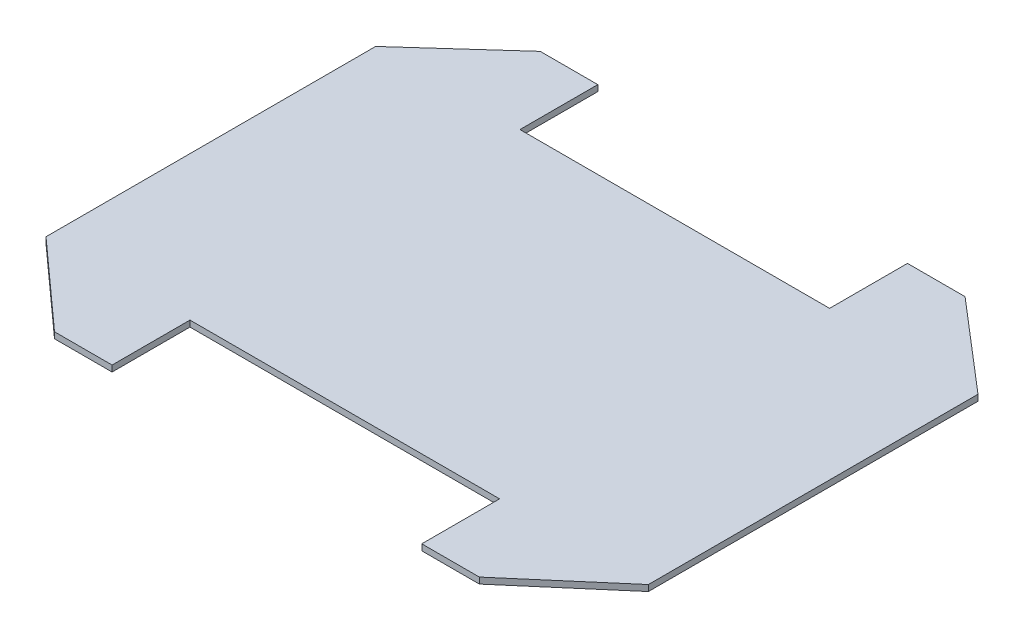
ISO-10303-21;
HEADER;
FILE_DESCRIPTION(('STEP AP214'),'2;1');
FILE_NAME('part.step','',(''),(''),'','','');
FILE_SCHEMA(('AUTOMOTIVE_DESIGN { 1 0 10303 214 1 1 1 1 }'));
ENDSEC;
DATA;
#1=APPLICATION_CONTEXT('core data for automotive mechanical design processes');
#2=APPLICATION_PROTOCOL_DEFINITION('international standard','automotive_design',2000,#1);
#3=PRODUCT_CONTEXT('',#1,'mechanical');
#4=PRODUCT('Part','Part','',(#3));
#5=PRODUCT_RELATED_PRODUCT_CATEGORY('part','',(#4));
#6=PRODUCT_DEFINITION_FORMATION('','',#4);
#7=PRODUCT_DEFINITION_CONTEXT('part definition',#1,'design');
#8=PRODUCT_DEFINITION('design','',#6,#7);
#9=PRODUCT_DEFINITION_SHAPE('','',#8);
#10=(LENGTH_UNIT() NAMED_UNIT(*) SI_UNIT(.MILLI.,.METRE.));
#11=(NAMED_UNIT(*) PLANE_ANGLE_UNIT() SI_UNIT($,.RADIAN.));
#12=(NAMED_UNIT(*) SI_UNIT($,.STERADIAN.) SOLID_ANGLE_UNIT());
#13=UNCERTAINTY_MEASURE_WITH_UNIT(LENGTH_MEASURE(1.E-05),#10,'distance_accuracy_value','');
#14=(GEOMETRIC_REPRESENTATION_CONTEXT(3) GLOBAL_UNCERTAINTY_ASSIGNED_CONTEXT((#13)) GLOBAL_UNIT_ASSIGNED_CONTEXT((#10,
#11,#12)) REPRESENTATION_CONTEXT('',''));
#15=CARTESIAN_POINT('',(0.,0.,0.));
#16=DIRECTION('',(0.,0.,1.));
#17=DIRECTION('',(1.,0.,0.));
#18=AXIS2_PLACEMENT_3D('',#15,#16,#17);
#19=CARTESIAN_POINT('',(-140.586469874335,5.5,-74.8243344297625));
#20=DIRECTION('',(-1.,0.,0.));
#21=DIRECTION('',(0.,0.,1.));
#22=AXIS2_PLACEMENT_3D('',#19,#20,#21);
#23=PLANE('',#22);
#24=DIRECTION('',(0.,0.,-1.));
#25=VECTOR('',#24,1.);
#26=CARTESIAN_POINT('',(-140.586469874335,0.,-74.8243344297625));
#27=LINE('',#26,#25);
#28=CARTESIAN_POINT('',(-140.586469874335,0.,-74.8243344297625));
#29=VERTEX_POINT('',#28);
#30=CARTESIAN_POINT('',(-140.586469874335,0.,-145.141499307877));
#31=VERTEX_POINT('',#30);
#32=EDGE_CURVE('E177',#29,#31,#27,.T.);
#33=ORIENTED_EDGE('',*,*,#32,.T.);
#34=DIRECTION('',(0.,-1.,0.));
#35=VECTOR('',#34,1.);
#36=CARTESIAN_POINT('',(-140.586469874335,5.5,-145.141499307877));
#37=LINE('',#36,#35);
#38=CARTESIAN_POINT('',(-140.586469874335,5.5,-145.141499307877));
#39=VERTEX_POINT('',#38);
#40=EDGE_CURVE('E11',#39,#31,#37,.T.);
#41=ORIENTED_EDGE('',*,*,#40,.F.);
#42=DIRECTION('',(0.,0.,-1.));
#43=VECTOR('',#42,1.);
#44=CARTESIAN_POINT('',(-140.586469874335,5.5,-74.8243344297625));
#45=LINE('',#44,#43);
#46=CARTESIAN_POINT('',(-140.586469874335,5.5,-74.8243344297625));
#47=VERTEX_POINT('',#46);
#48=EDGE_CURVE('E207',#47,#39,#45,.T.);
#49=ORIENTED_EDGE('',*,*,#48,.F.);
#50=DIRECTION('',(0.,-1.,0.));
#51=VECTOR('',#50,1.);
#52=CARTESIAN_POINT('',(-140.586469874335,5.5,-74.8243344297625));
#53=LINE('',#52,#51);
#54=EDGE_CURVE('E173',#47,#29,#53,.T.);
#55=ORIENTED_EDGE('',*,*,#54,.T.);
#56=EDGE_LOOP('',(#33,#41,#49,#55));
#57=FACE_BOUND('',#56,.T.);
#58=ADVANCED_FACE('F33',(#57),#23,.F.);
#59=CARTESIAN_POINT('',(-140.586469874335,5.5,-145.141499307877));
#60=DIRECTION('',(0.,0.,1.));
#61=DIRECTION('',(1.,0.,0.));
#62=AXIS2_PLACEMENT_3D('',#59,#60,#61);
#63=PLANE('',#62);
#64=DIRECTION('',(-1.,0.,0.));
#65=VECTOR('',#64,1.);
#66=CARTESIAN_POINT('',(-140.586469874335,0.,-145.141499307877));
#67=LINE('',#66,#65);
#68=CARTESIAN_POINT('',(-192.586469874335,0.,-145.141499307877));
#69=VERTEX_POINT('',#68);
#70=EDGE_CURVE('E180',#31,#69,#67,.T.);
#71=ORIENTED_EDGE('',*,*,#70,.T.);
#72=DIRECTION('',(0.,-1.,0.));
#73=VECTOR('',#72,1.);
#74=CARTESIAN_POINT('',(-192.586469874335,5.5,-145.141499307877));
#75=LINE('',#74,#73);
#76=CARTESIAN_POINT('',(-192.586469874335,5.5,-145.141499307877));
#77=VERTEX_POINT('',#76);
#78=EDGE_CURVE('E41',#77,#69,#75,.T.);
#79=ORIENTED_EDGE('',*,*,#78,.F.);
#80=DIRECTION('',(-1.,0.,0.));
#81=VECTOR('',#80,1.);
#82=CARTESIAN_POINT('',(-140.586469874335,5.5,-145.141499307877));
#83=LINE('',#82,#81);
#84=EDGE_CURVE('E116',#39,#77,#83,.T.);
#85=ORIENTED_EDGE('',*,*,#84,.F.);
#86=ORIENTED_EDGE('',*,*,#40,.T.);
#87=EDGE_LOOP('',(#71,#79,#85,#86));
#88=FACE_BOUND('',#87,.T.);
#89=ADVANCED_FACE('F305',(#88),#63,.F.);
#90=CARTESIAN_POINT('',(-270.75908450294,5.5,-74.6606808376328));
#91=DIRECTION('',(0.669623042952427,0.,0.7427011379735));
#92=DIRECTION('',(0.7427011379735,0.,-0.669623042952427));
#93=AXIS2_PLACEMENT_3D('',#90,#91,#92);
#94=PLANE('',#93);
#95=DIRECTION('',(-0.7427011379735,0.,0.669623042952427));
#96=VECTOR('',#95,1.);
#97=CARTESIAN_POINT('',(-270.75908450294,0.,-74.6606808376328));
#98=LINE('',#97,#96);
#99=CARTESIAN_POINT('',(-270.75908450294,0.,-74.6606808376328));
#100=VERTEX_POINT('',#99);
#101=EDGE_CURVE('E182',#69,#100,#98,.T.);
#102=ORIENTED_EDGE('',*,*,#101,.T.);
#103=DIRECTION('',(0.,-1.,0.));
#104=VECTOR('',#103,1.);
#105=CARTESIAN_POINT('',(-270.75908450294,5.5,-74.6606808376328));
#106=LINE('',#105,#104);
#107=CARTESIAN_POINT('',(-270.75908450294,5.5,-74.6606808376328));
#108=VERTEX_POINT('',#107);
#109=EDGE_CURVE('E238',#108,#100,#106,.T.);
#110=ORIENTED_EDGE('',*,*,#109,.F.);
#111=DIRECTION('',(-0.7427011379735,0.,0.669623042952427));
#112=VECTOR('',#111,1.);
#113=CARTESIAN_POINT('',(-270.75908450294,5.5,-74.6606808376328));
#114=LINE('',#113,#112);
#115=EDGE_CURVE('E246',#77,#108,#114,.T.);
#116=ORIENTED_EDGE('',*,*,#115,.F.);
#117=ORIENTED_EDGE('',*,*,#78,.T.);
#118=EDGE_LOOP('',(#102,#110,#116,#117));
#119=FACE_BOUND('',#118,.T.);
#120=ADVANCED_FACE('F244',(#119),#94,.F.);
#121=CARTESIAN_POINT('',(-270.75908450294,5.5,-74.6606808376328));
#122=DIRECTION('',(1.,0.,0.));
#123=DIRECTION('',(0.,0.,-1.));
#124=AXIS2_PLACEMENT_3D('',#121,#122,#123);
#125=PLANE('',#124);
#126=DIRECTION('',(0.,0.,1.));
#127=VECTOR('',#126,1.);
#128=CARTESIAN_POINT('',(-270.75908450294,0.,-74.6606808376328));
#129=LINE('',#128,#127);
#130=CARTESIAN_POINT('',(-270.75908450294,0.,223.012011978108));
#131=VERTEX_POINT('',#130);
#132=EDGE_CURVE('E184',#100,#131,#129,.T.);
#133=ORIENTED_EDGE('',*,*,#132,.T.);
#134=DIRECTION('',(0.,-1.,0.));
#135=VECTOR('',#134,1.);
#136=CARTESIAN_POINT('',(-270.75908450294,5.5,223.012011978108));
#137=LINE('',#136,#135);
#138=CARTESIAN_POINT('',(-270.75908450294,5.5,223.012011978108));
#139=VERTEX_POINT('',#138);
#140=EDGE_CURVE('E235',#139,#131,#137,.T.);
#141=ORIENTED_EDGE('',*,*,#140,.F.);
#142=DIRECTION('',(0.,0.,1.));
#143=VECTOR('',#142,1.);
#144=CARTESIAN_POINT('',(-270.75908450294,5.5,-74.6606808376328));
#145=LINE('',#144,#143);
#146=EDGE_CURVE('E264',#108,#139,#145,.T.);
#147=ORIENTED_EDGE('',*,*,#146,.F.);
#148=ORIENTED_EDGE('',*,*,#109,.T.);
#149=EDGE_LOOP('',(#133,#141,#147,#148));
#150=FACE_BOUND('',#149,.T.);
#151=ADVANCED_FACE('F255',(#150),#125,.F.);
#152=CARTESIAN_POINT('',(-270.75908450294,5.5,223.012011978108));
#153=DIRECTION('',(0.669623042952427,0.,-0.7427011379735));
#154=DIRECTION('',(-0.7427011379735,0.,-0.669623042952427));
#155=AXIS2_PLACEMENT_3D('',#152,#153,#154);
#156=PLANE('',#155);
#157=DIRECTION('',(0.7427011379735,0.,0.669623042952427));
#158=VECTOR('',#157,1.);
#159=CARTESIAN_POINT('',(-270.75908450294,0.,223.012011978108));
#160=LINE('',#159,#158);
#161=CARTESIAN_POINT('',(-192.586469874335,0.,293.492830448352));
#162=VERTEX_POINT('',#161);
#163=EDGE_CURVE('E186',#131,#162,#160,.T.);
#164=ORIENTED_EDGE('',*,*,#163,.T.);
#165=DIRECTION('',(0.,-1.,0.));
#166=VECTOR('',#165,1.);
#167=CARTESIAN_POINT('',(-192.586469874335,5.5,293.492830448352));
#168=LINE('',#167,#166);
#169=CARTESIAN_POINT('',(-192.586469874335,5.5,293.492830448352));
#170=VERTEX_POINT('',#169);
#171=EDGE_CURVE('E232',#170,#162,#168,.T.);
#172=ORIENTED_EDGE('',*,*,#171,.F.);
#173=DIRECTION('',(0.7427011379735,0.,0.669623042952427));
#174=VECTOR('',#173,1.);
#175=CARTESIAN_POINT('',(-270.75908450294,5.5,223.012011978108));
#176=LINE('',#175,#174);
#177=EDGE_CURVE('E261',#139,#170,#176,.T.);
#178=ORIENTED_EDGE('',*,*,#177,.F.);
#179=ORIENTED_EDGE('',*,*,#140,.T.);
#180=EDGE_LOOP('',(#164,#172,#178,#179));
#181=FACE_BOUND('',#180,.T.);
#182=ADVANCED_FACE('F259',(#181),#156,.F.);
#183=CARTESIAN_POINT('',(-140.586469874335,5.5,293.492830448352));
#184=DIRECTION('',(0.,0.,-1.));
#185=DIRECTION('',(-1.,0.,0.));
#186=AXIS2_PLACEMENT_3D('',#183,#184,#185);
#187=PLANE('',#186);
#188=DIRECTION('',(1.,0.,0.));
#189=VECTOR('',#188,1.);
#190=CARTESIAN_POINT('',(-140.586469874335,0.,293.492830448352));
#191=LINE('',#190,#189);
#192=CARTESIAN_POINT('',(-140.586469874335,0.,293.492830448352));
#193=VERTEX_POINT('',#192);
#194=EDGE_CURVE('E188',#162,#193,#191,.T.);
#195=ORIENTED_EDGE('',*,*,#194,.T.);
#196=DIRECTION('',(0.,-1.,0.));
#197=VECTOR('',#196,1.);
#198=CARTESIAN_POINT('',(-140.586469874335,5.5,293.492830448352));
#199=LINE('',#198,#197);
#200=CARTESIAN_POINT('',(-140.586469874335,5.5,293.492830448352));
#201=VERTEX_POINT('',#200);
#202=EDGE_CURVE('E229',#201,#193,#199,.T.);
#203=ORIENTED_EDGE('',*,*,#202,.F.);
#204=DIRECTION('',(1.,0.,0.));
#205=VECTOR('',#204,1.);
#206=CARTESIAN_POINT('',(-140.586469874335,5.5,293.492830448352));
#207=LINE('',#206,#205);
#208=EDGE_CURVE('E263',#170,#201,#207,.T.);
#209=ORIENTED_EDGE('',*,*,#208,.F.);
#210=ORIENTED_EDGE('',*,*,#171,.T.);
#211=EDGE_LOOP('',(#195,#203,#209,#210));
#212=FACE_BOUND('',#211,.T.);
#213=ADVANCED_FACE('F318',(#212),#187,.F.);
#214=CARTESIAN_POINT('',(-140.586469874335,5.5,223.175665570237));
#215=DIRECTION('',(-1.,0.,0.));
#216=DIRECTION('',(0.,0.,1.));
#217=AXIS2_PLACEMENT_3D('',#214,#215,#216);
#218=PLANE('',#217);
#219=DIRECTION('',(0.,0.,-1.));
#220=VECTOR('',#219,1.);
#221=CARTESIAN_POINT('',(-140.586469874335,0.,223.175665570237));
#222=LINE('',#221,#220);
#223=CARTESIAN_POINT('',(-140.586469874335,0.,223.175665570237));
#224=VERTEX_POINT('',#223);
#225=EDGE_CURVE('E190',#193,#224,#222,.T.);
#226=ORIENTED_EDGE('',*,*,#225,.T.);
#227=DIRECTION('',(0.,-1.,0.));
#228=VECTOR('',#227,1.);
#229=CARTESIAN_POINT('',(-140.586469874335,5.5,223.175665570237));
#230=LINE('',#229,#228);
#231=CARTESIAN_POINT('',(-140.586469874335,5.5,223.175665570237));
#232=VERTEX_POINT('',#231);
#233=EDGE_CURVE('E226',#232,#224,#230,.T.);
#234=ORIENTED_EDGE('',*,*,#233,.F.);
#235=DIRECTION('',(0.,0.,-1.));
#236=VECTOR('',#235,1.);
#237=CARTESIAN_POINT('',(-140.586469874335,5.5,223.175665570237));
#238=LINE('',#237,#236);
#239=EDGE_CURVE('E266',#201,#232,#238,.T.);
#240=ORIENTED_EDGE('',*,*,#239,.F.);
#241=ORIENTED_EDGE('',*,*,#202,.T.);
#242=EDGE_LOOP('',(#226,#234,#240,#241));
#243=FACE_BOUND('',#242,.T.);
#244=ADVANCED_FACE('F321',(#243),#218,.F.);
#245=CARTESIAN_POINT('',(-140.586469874335,5.5,223.175665570237));
#246=DIRECTION('',(0.,0.,-1.));
#247=DIRECTION('',(-1.,0.,0.));
#248=AXIS2_PLACEMENT_3D('',#245,#246,#247);
#249=PLANE('',#248);
#250=DIRECTION('',(1.,0.,0.));
#251=VECTOR('',#250,1.);
#252=CARTESIAN_POINT('',(-140.586469874335,0.,223.175665570237));
#253=LINE('',#252,#251);
#254=CARTESIAN_POINT('',(139.068300868454,0.,223.175665570237));
#255=VERTEX_POINT('',#254);
#256=EDGE_CURVE('E192',#224,#255,#253,.T.);
#257=ORIENTED_EDGE('',*,*,#256,.T.);
#258=DIRECTION('',(0.,-1.,0.));
#259=VECTOR('',#258,1.);
#260=CARTESIAN_POINT('',(139.068300868454,5.5,223.175665570237));
#261=LINE('',#260,#259);
#262=CARTESIAN_POINT('',(139.068300868454,5.5,223.175665570237));
#263=VERTEX_POINT('',#262);
#264=EDGE_CURVE('E223',#263,#255,#261,.T.);
#265=ORIENTED_EDGE('',*,*,#264,.F.);
#266=DIRECTION('',(1.,0.,0.));
#267=VECTOR('',#266,1.);
#268=CARTESIAN_POINT('',(-140.586469874335,5.5,223.175665570237));
#269=LINE('',#268,#267);
#270=EDGE_CURVE('E272',#232,#263,#269,.T.);
#271=ORIENTED_EDGE('',*,*,#270,.F.);
#272=ORIENTED_EDGE('',*,*,#233,.T.);
#273=EDGE_LOOP('',(#257,#265,#271,#272));
#274=FACE_BOUND('',#273,.T.);
#275=ADVANCED_FACE('F325',(#274),#249,.F.);
#276=CARTESIAN_POINT('',(139.068300868454,5.5,223.175665570237));
#277=DIRECTION('',(1.,0.,0.));
#278=DIRECTION('',(0.,0.,-1.));
#279=AXIS2_PLACEMENT_3D('',#276,#277,#278);
#280=PLANE('',#279);
#281=DIRECTION('',(0.,0.,1.));
#282=VECTOR('',#281,1.);
#283=CARTESIAN_POINT('',(139.068300868454,0.,223.175665570237));
#284=LINE('',#283,#282);
#285=CARTESIAN_POINT('',(139.068300868454,0.,293.492830448352));
#286=VERTEX_POINT('',#285);
#287=EDGE_CURVE('E194',#255,#286,#284,.T.);
#288=ORIENTED_EDGE('',*,*,#287,.T.);
#289=DIRECTION('',(0.,-1.,0.));
#290=VECTOR('',#289,1.);
#291=CARTESIAN_POINT('',(139.068300868454,5.5,293.492830448352));
#292=LINE('',#291,#290);
#293=CARTESIAN_POINT('',(139.068300868454,5.5,293.492830448352));
#294=VERTEX_POINT('',#293);
#295=EDGE_CURVE('E220',#294,#286,#292,.T.);
#296=ORIENTED_EDGE('',*,*,#295,.F.);
#297=DIRECTION('',(0.,0.,1.));
#298=VECTOR('',#297,1.);
#299=CARTESIAN_POINT('',(139.068300868454,5.5,223.175665570237));
#300=LINE('',#299,#298);
#301=EDGE_CURVE('E274',#263,#294,#300,.T.);
#302=ORIENTED_EDGE('',*,*,#301,.F.);
#303=ORIENTED_EDGE('',*,*,#264,.T.);
#304=EDGE_LOOP('',(#288,#296,#302,#303));
#305=FACE_BOUND('',#304,.T.);
#306=ADVANCED_FACE('F329',(#305),#280,.F.);
#307=CARTESIAN_POINT('',(139.068300868454,5.5,293.492830448352));
#308=DIRECTION('',(0.,0.,-1.));
#309=DIRECTION('',(-1.,0.,0.));
#310=AXIS2_PLACEMENT_3D('',#307,#308,#309);
#311=PLANE('',#310);
#312=DIRECTION('',(1.,0.,0.));
#313=VECTOR('',#312,1.);
#314=CARTESIAN_POINT('',(139.068300868454,0.,293.492830448352));
#315=LINE('',#314,#313);
#316=CARTESIAN_POINT('',(191.068300868454,0.,293.492830448352));
#317=VERTEX_POINT('',#316);
#318=EDGE_CURVE('E196',#286,#317,#315,.T.);
#319=ORIENTED_EDGE('',*,*,#318,.T.);
#320=DIRECTION('',(0.,-1.,0.));
#321=VECTOR('',#320,1.);
#322=CARTESIAN_POINT('',(191.068300868454,5.5,293.492830448352));
#323=LINE('',#322,#321);
#324=CARTESIAN_POINT('',(191.068300868454,5.5,293.492830448352));
#325=VERTEX_POINT('',#324);
#326=EDGE_CURVE('E217',#325,#317,#323,.T.);
#327=ORIENTED_EDGE('',*,*,#326,.F.);
#328=DIRECTION('',(1.,0.,0.));
#329=VECTOR('',#328,1.);
#330=CARTESIAN_POINT('',(139.068300868454,5.5,293.492830448352));
#331=LINE('',#330,#329);
#332=EDGE_CURVE('E276',#294,#325,#331,.T.);
#333=ORIENTED_EDGE('',*,*,#332,.F.);
#334=ORIENTED_EDGE('',*,*,#295,.T.);
#335=EDGE_LOOP('',(#319,#327,#333,#334));
#336=FACE_BOUND('',#335,.T.);
#337=ADVANCED_FACE('F333',(#336),#311,.F.);
#338=CARTESIAN_POINT('',(273.24091549706,5.5,223.012011978108));
#339=DIRECTION('',(-0.651042402792643,0.,-0.759041362355163));
#340=DIRECTION('',(-0.759041362355163,0.,0.651042402792643));
#341=AXIS2_PLACEMENT_3D('',#338,#339,#340);
#342=PLANE('',#341);
#343=DIRECTION('',(0.759041362355163,0.,-0.651042402792643));
#344=VECTOR('',#343,1.);
#345=CARTESIAN_POINT('',(273.24091549706,0.,223.012011978108));
#346=LINE('',#345,#344);
#347=CARTESIAN_POINT('',(273.24091549706,0.,223.012011978108));
#348=VERTEX_POINT('',#347);
#349=EDGE_CURVE('E198',#317,#348,#346,.T.);
#350=ORIENTED_EDGE('',*,*,#349,.T.);
#351=DIRECTION('',(0.,-1.,0.));
#352=VECTOR('',#351,1.);
#353=CARTESIAN_POINT('',(273.24091549706,5.5,223.012011978108));
#354=LINE('',#353,#352);
#355=CARTESIAN_POINT('',(273.24091549706,5.5,223.012011978108));
#356=VERTEX_POINT('',#355);
#357=EDGE_CURVE('E214',#356,#348,#354,.T.);
#358=ORIENTED_EDGE('',*,*,#357,.F.);
#359=DIRECTION('',(0.759041362355163,0.,-0.651042402792643));
#360=VECTOR('',#359,1.);
#361=CARTESIAN_POINT('',(273.24091549706,5.5,223.012011978108));
#362=LINE('',#361,#360);
#363=EDGE_CURVE('E278',#325,#356,#362,.T.);
#364=ORIENTED_EDGE('',*,*,#363,.F.);
#365=ORIENTED_EDGE('',*,*,#326,.T.);
#366=EDGE_LOOP('',(#350,#358,#364,#365));
#367=FACE_BOUND('',#366,.T.);
#368=ADVANCED_FACE('F337',(#367),#342,.F.);
#369=CARTESIAN_POINT('',(273.24091549706,5.5,-74.6606808376328));
#370=DIRECTION('',(-1.,0.,0.));
#371=DIRECTION('',(0.,0.,1.));
#372=AXIS2_PLACEMENT_3D('',#369,#370,#371);
#373=PLANE('',#372);
#374=DIRECTION('',(0.,0.,-1.));
#375=VECTOR('',#374,1.);
#376=CARTESIAN_POINT('',(273.24091549706,0.,-74.6606808376328));
#377=LINE('',#376,#375);
#378=CARTESIAN_POINT('',(273.24091549706,0.,-74.6606808376328));
#379=VERTEX_POINT('',#378);
#380=EDGE_CURVE('E200',#348,#379,#377,.T.);
#381=ORIENTED_EDGE('',*,*,#380,.T.);
#382=DIRECTION('',(0.,-1.,0.));
#383=VECTOR('',#382,1.);
#384=CARTESIAN_POINT('',(273.24091549706,5.5,-74.6606808376328));
#385=LINE('',#384,#383);
#386=CARTESIAN_POINT('',(273.24091549706,5.5,-74.6606808376328));
#387=VERTEX_POINT('',#386);
#388=EDGE_CURVE('E211',#387,#379,#385,.T.);
#389=ORIENTED_EDGE('',*,*,#388,.F.);
#390=DIRECTION('',(0.,0.,-1.));
#391=VECTOR('',#390,1.);
#392=CARTESIAN_POINT('',(273.24091549706,5.5,-74.6606808376328));
#393=LINE('',#392,#391);
#394=EDGE_CURVE('E280',#356,#387,#393,.T.);
#395=ORIENTED_EDGE('',*,*,#394,.F.);
#396=ORIENTED_EDGE('',*,*,#357,.T.);
#397=EDGE_LOOP('',(#381,#389,#395,#396));
#398=FACE_BOUND('',#397,.T.);
#399=ADVANCED_FACE('F286',(#398),#373,.F.);
#400=CARTESIAN_POINT('',(273.24091549706,5.5,-74.6606808376328));
#401=DIRECTION('',(-0.651042402792644,0.,0.759041362355163));
#402=DIRECTION('',(0.759041362355163,0.,0.651042402792644));
#403=AXIS2_PLACEMENT_3D('',#400,#401,#402);
#404=PLANE('',#403);
#405=DIRECTION('',(-0.759041362355163,0.,-0.651042402792643));
#406=VECTOR('',#405,1.);
#407=CARTESIAN_POINT('',(273.24091549706,0.,-74.6606808376328));
#408=LINE('',#407,#406);
#409=CARTESIAN_POINT('',(191.068300868454,0.,-145.141499307877));
#410=VERTEX_POINT('',#409);
#411=EDGE_CURVE('E202',#379,#410,#408,.T.);
#412=ORIENTED_EDGE('',*,*,#411,.T.);
#413=DIRECTION('',(0.,-1.,0.));
#414=VECTOR('',#413,1.);
#415=CARTESIAN_POINT('',(191.068300868454,5.5,-145.141499307877));
#416=LINE('',#415,#414);
#417=CARTESIAN_POINT('',(191.068300868454,5.5,-145.141499307877));
#418=VERTEX_POINT('',#417);
#419=EDGE_CURVE('E168',#418,#410,#416,.T.);
#420=ORIENTED_EDGE('',*,*,#419,.F.);
#421=DIRECTION('',(-0.759041362355163,0.,-0.651042402792643));
#422=VECTOR('',#421,1.);
#423=CARTESIAN_POINT('',(273.24091549706,5.5,-74.6606808376328));
#424=LINE('',#423,#422);
#425=EDGE_CURVE('E159',#387,#418,#424,.T.);
#426=ORIENTED_EDGE('',*,*,#425,.F.);
#427=ORIENTED_EDGE('',*,*,#388,.T.);
#428=EDGE_LOOP('',(#412,#420,#426,#427));
#429=FACE_BOUND('',#428,.T.);
#430=ADVANCED_FACE('F290',(#429),#404,.F.);
#431=CARTESIAN_POINT('',(139.068300868454,5.5,-145.141499307877));
#432=DIRECTION('',(0.,0.,1.));
#433=DIRECTION('',(1.,0.,0.));
#434=AXIS2_PLACEMENT_3D('',#431,#432,#433);
#435=PLANE('',#434);
#436=DIRECTION('',(-1.,0.,0.));
#437=VECTOR('',#436,1.);
#438=CARTESIAN_POINT('',(139.068300868454,0.,-145.141499307877));
#439=LINE('',#438,#437);
#440=CARTESIAN_POINT('',(139.068300868454,0.,-145.141499307877));
#441=VERTEX_POINT('',#440);
#442=EDGE_CURVE('E167',#410,#441,#439,.T.);
#443=ORIENTED_EDGE('',*,*,#442,.T.);
#444=DIRECTION('',(0.,-1.,0.));
#445=VECTOR('',#444,1.);
#446=CARTESIAN_POINT('',(139.068300868454,5.5,-145.141499307877));
#447=LINE('',#446,#445);
#448=CARTESIAN_POINT('',(139.068300868454,5.5,-145.141499307877));
#449=VERTEX_POINT('',#448);
#450=EDGE_CURVE('E164',#449,#441,#447,.T.);
#451=ORIENTED_EDGE('',*,*,#450,.F.);
#452=DIRECTION('',(-1.,0.,0.));
#453=VECTOR('',#452,1.);
#454=CARTESIAN_POINT('',(139.068300868454,5.5,-145.141499307877));
#455=LINE('',#454,#453);
#456=EDGE_CURVE('E153',#418,#449,#455,.T.);
#457=ORIENTED_EDGE('',*,*,#456,.F.);
#458=ORIENTED_EDGE('',*,*,#419,.T.);
#459=EDGE_LOOP('',(#443,#451,#457,#458));
#460=FACE_BOUND('',#459,.T.);
#461=ADVANCED_FACE('F165',(#460),#435,.F.);
#462=CARTESIAN_POINT('',(139.068300868454,5.5,-74.8243344297626));
#463=DIRECTION('',(1.,0.,0.));
#464=DIRECTION('',(0.,0.,-1.));
#465=AXIS2_PLACEMENT_3D('',#462,#463,#464);
#466=PLANE('',#465);
#467=DIRECTION('',(0.,0.,1.));
#468=VECTOR('',#467,1.);
#469=CARTESIAN_POINT('',(139.068300868454,0.,-74.8243344297626));
#470=LINE('',#469,#468);
#471=CARTESIAN_POINT('',(139.068300868454,0.,-74.8243344297626));
#472=VERTEX_POINT('',#471);
#473=EDGE_CURVE('E102',#441,#472,#470,.T.);
#474=ORIENTED_EDGE('',*,*,#473,.T.);
#475=DIRECTION('',(0.,-1.,0.));
#476=VECTOR('',#475,1.);
#477=CARTESIAN_POINT('',(139.068300868454,5.5,-74.8243344297626));
#478=LINE('',#477,#476);
#479=CARTESIAN_POINT('',(139.068300868454,5.5,-74.8243344297626));
#480=VERTEX_POINT('',#479);
#481=EDGE_CURVE('E169',#480,#472,#478,.T.);
#482=ORIENTED_EDGE('',*,*,#481,.F.);
#483=DIRECTION('',(0.,0.,1.));
#484=VECTOR('',#483,1.);
#485=CARTESIAN_POINT('',(139.068300868454,5.5,-74.8243344297626));
#486=LINE('',#485,#484);
#487=EDGE_CURVE('E157',#449,#480,#486,.T.);
#488=ORIENTED_EDGE('',*,*,#487,.F.);
#489=ORIENTED_EDGE('',*,*,#450,.T.);
#490=EDGE_LOOP('',(#474,#482,#488,#489));
#491=FACE_BOUND('',#490,.T.);
#492=ADVANCED_FACE('F171',(#491),#466,.F.);
#493=CARTESIAN_POINT('',(-140.586469874335,5.5,-74.8243344297625));
#494=DIRECTION('',(0.,0.,1.));
#495=DIRECTION('',(1.,0.,0.));
#496=AXIS2_PLACEMENT_3D('',#493,#494,#495);
#497=PLANE('',#496);
#498=DIRECTION('',(-1.,0.,0.));
#499=VECTOR('',#498,1.);
#500=CARTESIAN_POINT('',(-140.586469874335,0.,-74.8243344297625));
#501=LINE('',#500,#499);
#502=EDGE_CURVE('E108',#472,#29,#501,.T.);
#503=ORIENTED_EDGE('',*,*,#502,.T.);
#504=ORIENTED_EDGE('',*,*,#54,.F.);
#505=DIRECTION('',(-1.,0.,0.));
#506=VECTOR('',#505,1.);
#507=CARTESIAN_POINT('',(-140.586469874335,5.5,-74.8243344297625));
#508=LINE('',#507,#506);
#509=EDGE_CURVE('E49',#480,#47,#508,.T.);
#510=ORIENTED_EDGE('',*,*,#509,.F.);
#511=ORIENTED_EDGE('',*,*,#481,.T.);
#512=EDGE_LOOP('',(#503,#504,#510,#511));
#513=FACE_BOUND('',#512,.T.);
#514=ADVANCED_FACE('F294',(#513),#497,.F.);
#515=CARTESIAN_POINT('',(-140.586469874335,5.5,-145.141499307877));
#516=DIRECTION('',(0.,1.,0.));
#517=DIRECTION('',(0.,0.,1.));
#518=AXIS2_PLACEMENT_3D('',#515,#516,#517);
#519=PLANE('',#518);
#520=ORIENTED_EDGE('',*,*,#48,.T.);
#521=ORIENTED_EDGE('',*,*,#84,.T.);
#522=ORIENTED_EDGE('',*,*,#115,.T.);
#523=ORIENTED_EDGE('',*,*,#146,.T.);
#524=ORIENTED_EDGE('',*,*,#177,.T.);
#525=ORIENTED_EDGE('',*,*,#208,.T.);
#526=ORIENTED_EDGE('',*,*,#239,.T.);
#527=ORIENTED_EDGE('',*,*,#270,.T.);
#528=ORIENTED_EDGE('',*,*,#301,.T.);
#529=ORIENTED_EDGE('',*,*,#332,.T.);
#530=ORIENTED_EDGE('',*,*,#363,.T.);
#531=ORIENTED_EDGE('',*,*,#394,.T.);
#532=ORIENTED_EDGE('',*,*,#425,.T.);
#533=ORIENTED_EDGE('',*,*,#456,.T.);
#534=ORIENTED_EDGE('',*,*,#487,.T.);
#535=ORIENTED_EDGE('',*,*,#509,.T.);
#536=EDGE_LOOP('',(#520,#521,#522,#523,#524,#525,#526,#527,#528,#529,#530,#531,#532,#533,#534,#535));
#537=FACE_BOUND('',#536,.T.);
#538=ADVANCED_FACE('F155',(#537),#519,.T.);
#539=CARTESIAN_POINT('',(-140.586469874335,0.,-145.141499307877));
#540=DIRECTION('',(0.,1.,0.));
#541=DIRECTION('',(0.,0.,1.));
#542=AXIS2_PLACEMENT_3D('',#539,#540,#541);
#543=PLANE('',#542);
#544=ORIENTED_EDGE('',*,*,#32,.F.);
#545=ORIENTED_EDGE('',*,*,#502,.F.);
#546=ORIENTED_EDGE('',*,*,#473,.F.);
#547=ORIENTED_EDGE('',*,*,#442,.F.);
#548=ORIENTED_EDGE('',*,*,#411,.F.);
#549=ORIENTED_EDGE('',*,*,#380,.F.);
#550=ORIENTED_EDGE('',*,*,#349,.F.);
#551=ORIENTED_EDGE('',*,*,#318,.F.);
#552=ORIENTED_EDGE('',*,*,#287,.F.);
#553=ORIENTED_EDGE('',*,*,#256,.F.);
#554=ORIENTED_EDGE('',*,*,#225,.F.);
#555=ORIENTED_EDGE('',*,*,#194,.F.);
#556=ORIENTED_EDGE('',*,*,#163,.F.);
#557=ORIENTED_EDGE('',*,*,#132,.F.);
#558=ORIENTED_EDGE('',*,*,#101,.F.);
#559=ORIENTED_EDGE('',*,*,#70,.F.);
#560=EDGE_LOOP('',(#544,#545,#546,#547,#548,#549,#550,#551,#552,#553,#554,#555,#556,#557,#558,#559));
#561=FACE_BOUND('',#560,.T.);
#562=ADVANCED_FACE('F250',(#561),#543,.F.);
#563=CLOSED_SHELL('',(#58,#89,#120,#151,#182,#213,#244,#275,#306,#337,#368,#399,#430,#461,#492,
#514,#538,#562));
#564=MANIFOLD_SOLID_BREP('B2',#563);
#565=ADVANCED_BREP_SHAPE_REPRESENTATION('',(#18,#564),#14);
#566=SHAPE_DEFINITION_REPRESENTATION(#9,#565);
ENDSEC;
END-ISO-10303-21;
